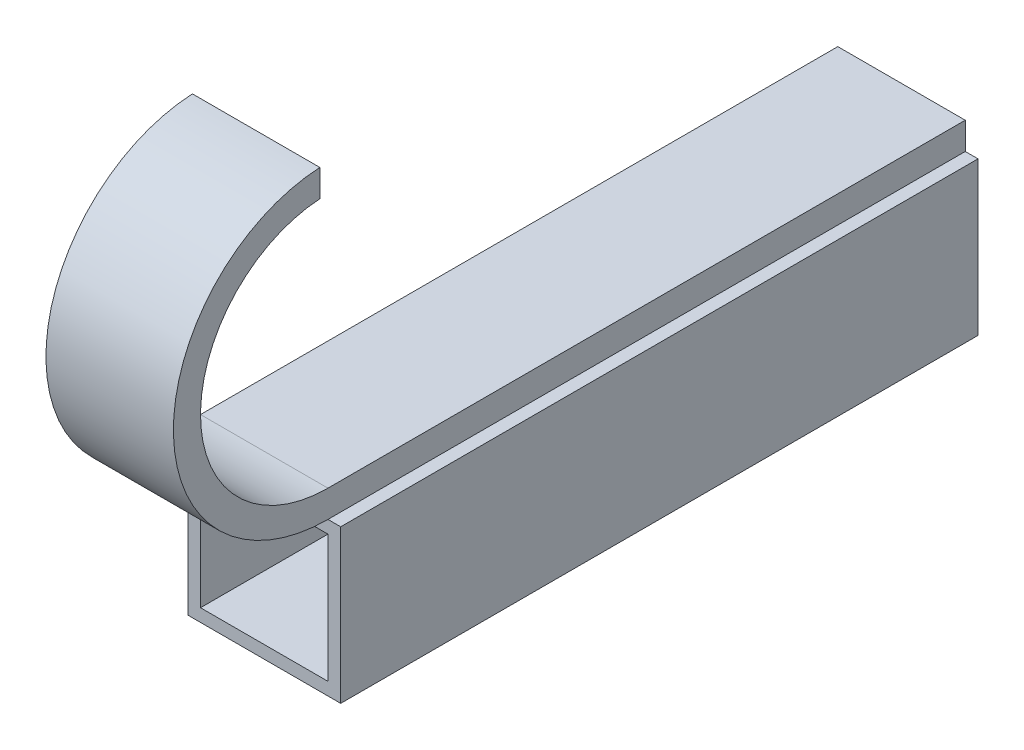
ISO-10303-21;
HEADER;
FILE_DESCRIPTION(('STEP AP214'),'2;1');
FILE_NAME('part.step','',(''),(''),'','','');
FILE_SCHEMA(('AUTOMOTIVE_DESIGN { 1 0 10303 214 1 1 1 1 }'));
ENDSEC;
DATA;
#1=APPLICATION_CONTEXT('core data for automotive mechanical design processes');
#2=APPLICATION_PROTOCOL_DEFINITION('international standard','automotive_design',2000,#1);
#3=PRODUCT_CONTEXT('',#1,'mechanical');
#4=PRODUCT('Part','Part','',(#3));
#5=PRODUCT_RELATED_PRODUCT_CATEGORY('part','',(#4));
#6=PRODUCT_DEFINITION_FORMATION('','',#4);
#7=PRODUCT_DEFINITION_CONTEXT('part definition',#1,'design');
#8=PRODUCT_DEFINITION('design','',#6,#7);
#9=PRODUCT_DEFINITION_SHAPE('','',#8);
#10=(LENGTH_UNIT() NAMED_UNIT(*) SI_UNIT(.MILLI.,.METRE.));
#11=(NAMED_UNIT(*) PLANE_ANGLE_UNIT() SI_UNIT($,.RADIAN.));
#12=(NAMED_UNIT(*) SI_UNIT($,.STERADIAN.) SOLID_ANGLE_UNIT());
#13=UNCERTAINTY_MEASURE_WITH_UNIT(LENGTH_MEASURE(1.E-05),#10,'distance_accuracy_value','');
#14=(GEOMETRIC_REPRESENTATION_CONTEXT(3) GLOBAL_UNCERTAINTY_ASSIGNED_CONTEXT((#13)) GLOBAL_UNIT_ASSIGNED_CONTEXT((#10,
#11,#12)) REPRESENTATION_CONTEXT('',''));
#15=CARTESIAN_POINT('',(0.,0.,0.));
#16=DIRECTION('',(0.,0.,1.));
#17=DIRECTION('',(1.,0.,0.));
#18=AXIS2_PLACEMENT_3D('',#15,#16,#17);
#19=CARTESIAN_POINT('',(-2.54,27.94,127.));
#20=DIRECTION('',(0.,-1.,0.));
#21=DIRECTION('',(0.,0.,-1.));
#22=AXIS2_PLACEMENT_3D('',#19,#20,#21);
#23=PLANE('',#22);
#24=DIRECTION('',(0.,0.,-1.));
#25=VECTOR('',#24,1.);
#26=CARTESIAN_POINT('',(25.4,27.94,127.));
#27=LINE('',#26,#25);
#28=CARTESIAN_POINT('',(25.4,27.94,127.));
#29=VERTEX_POINT('',#28);
#30=CARTESIAN_POINT('',(25.4,27.94,0.));
#31=VERTEX_POINT('',#30);
#32=EDGE_CURVE('E147',#29,#31,#27,.T.);
#33=ORIENTED_EDGE('',*,*,#32,.F.);
#34=DIRECTION('',(-1.,0.,0.));
#35=VECTOR('',#34,1.);
#36=CARTESIAN_POINT('',(-2.54,27.94,127.));
#37=LINE('',#36,#35);
#38=CARTESIAN_POINT('',(27.94,27.94,127.));
#39=VERTEX_POINT('',#38);
#40=EDGE_CURVE('E195',#39,#29,#37,.T.);
#41=ORIENTED_EDGE('',*,*,#40,.F.);
#42=DIRECTION('',(0.,0.,-1.));
#43=VECTOR('',#42,1.);
#44=CARTESIAN_POINT('',(27.94,27.94,127.));
#45=LINE('',#44,#43);
#46=CARTESIAN_POINT('',(27.94,27.94,0.));
#47=VERTEX_POINT('',#46);
#48=EDGE_CURVE('E41',#39,#47,#45,.T.);
#49=ORIENTED_EDGE('',*,*,#48,.T.);
#50=DIRECTION('',(-1.,0.,0.));
#51=VECTOR('',#50,1.);
#52=CARTESIAN_POINT('',(-2.54,27.94,0.));
#53=LINE('',#52,#51);
#54=EDGE_CURVE('E141',#47,#31,#53,.T.);
#55=ORIENTED_EDGE('',*,*,#54,.T.);
#56=EDGE_LOOP('',(#33,#41,#49,#55));
#57=FACE_BOUND('',#56,.T.);
#58=ADVANCED_FACE('F33',(#57),#23,.F.);
#59=CARTESIAN_POINT('',(0.,0.,127.));
#60=DIRECTION('',(0.,0.,1.));
#61=DIRECTION('',(1.,0.,0.));
#62=AXIS2_PLACEMENT_3D('',#59,#60,#61);
#63=PLANE('',#62);
#64=DIRECTION('',(1.,0.,0.));
#65=VECTOR('',#64,1.);
#66=CARTESIAN_POINT('',(-2.54,-2.54,127.));
#67=LINE('',#66,#65);
#68=CARTESIAN_POINT('',(-2.54,-2.54,127.));
#69=VERTEX_POINT('',#68);
#70=CARTESIAN_POINT('',(27.94,-2.54,127.));
#71=VERTEX_POINT('',#70);
#72=EDGE_CURVE('E164',#69,#71,#67,.T.);
#73=ORIENTED_EDGE('',*,*,#72,.T.);
#74=DIRECTION('',(0.,1.,0.));
#75=VECTOR('',#74,1.);
#76=CARTESIAN_POINT('',(27.94,-2.54,127.));
#77=LINE('',#76,#75);
#78=EDGE_CURVE('E198',#71,#39,#77,.T.);
#79=ORIENTED_EDGE('',*,*,#78,.T.);
#80=ORIENTED_EDGE('',*,*,#40,.T.);
#81=DIRECTION('',(-1.,0.,0.));
#82=VECTOR('',#81,1.);
#83=CARTESIAN_POINT('',(25.4,27.94,127.));
#84=LINE('',#83,#82);
#85=CARTESIAN_POINT('',(0.,27.94,127.));
#86=VERTEX_POINT('',#85);
#87=EDGE_CURVE('E237',#29,#86,#84,.T.);
#88=ORIENTED_EDGE('',*,*,#87,.T.);
#89=CARTESIAN_POINT('',(-2.54,27.94,127.));
#90=VERTEX_POINT('',#89);
#91=EDGE_CURVE('E197',#86,#90,#37,.T.);
#92=ORIENTED_EDGE('',*,*,#91,.T.);
#93=DIRECTION('',(0.,-1.,0.));
#94=VECTOR('',#93,1.);
#95=CARTESIAN_POINT('',(-2.54,-2.54,127.));
#96=LINE('',#95,#94);
#97=EDGE_CURVE('E174',#90,#69,#96,.T.);
#98=ORIENTED_EDGE('',*,*,#97,.T.);
#99=EDGE_LOOP('',(#73,#79,#80,#88,#92,#98));
#100=FACE_BOUND('',#99,.T.);
#101=DIRECTION('',(1.,0.,0.));
#102=VECTOR('',#101,1.);
#103=CARTESIAN_POINT('',(0.,0.,127.));
#104=LINE('',#103,#102);
#105=CARTESIAN_POINT('',(0.,0.,127.));
#106=VERTEX_POINT('',#105);
#107=CARTESIAN_POINT('',(25.4,0.,127.));
#108=VERTEX_POINT('',#107);
#109=EDGE_CURVE('E224',#106,#108,#104,.T.);
#110=ORIENTED_EDGE('',*,*,#109,.F.);
#111=DIRECTION('',(0.,-1.,0.));
#112=VECTOR('',#111,1.);
#113=CARTESIAN_POINT('',(0.,0.,127.));
#114=LINE('',#113,#112);
#115=CARTESIAN_POINT('',(0.,25.4,127.));
#116=VERTEX_POINT('',#115);
#117=EDGE_CURVE('E211',#116,#106,#114,.T.);
#118=ORIENTED_EDGE('',*,*,#117,.F.);
#119=DIRECTION('',(-1.,0.,0.));
#120=VECTOR('',#119,1.);
#121=CARTESIAN_POINT('',(0.,25.4,127.));
#122=LINE('',#121,#120);
#123=CARTESIAN_POINT('',(25.4,25.4,127.));
#124=VERTEX_POINT('',#123);
#125=EDGE_CURVE('E207',#124,#116,#122,.T.);
#126=ORIENTED_EDGE('',*,*,#125,.F.);
#127=DIRECTION('',(0.,1.,0.));
#128=VECTOR('',#127,1.);
#129=CARTESIAN_POINT('',(25.4,0.,127.));
#130=LINE('',#129,#128);
#131=EDGE_CURVE('E222',#108,#124,#130,.T.);
#132=ORIENTED_EDGE('',*,*,#131,.F.);
#133=EDGE_LOOP('',(#110,#118,#126,#132));
#134=FACE_BOUND('',#133,.T.);
#135=ADVANCED_FACE('F272',(#100,#134),#63,.T.);
#136=CARTESIAN_POINT('',(0.,0.,0.));
#137=DIRECTION('',(0.,0.,1.));
#138=DIRECTION('',(1.,0.,0.));
#139=AXIS2_PLACEMENT_3D('',#136,#137,#138);
#140=PLANE('',#139);
#141=DIRECTION('',(1.,0.,0.));
#142=VECTOR('',#141,1.);
#143=CARTESIAN_POINT('',(-2.54,-2.54,0.));
#144=LINE('',#143,#142);
#145=CARTESIAN_POINT('',(-2.54,-2.54,0.));
#146=VERTEX_POINT('',#145);
#147=CARTESIAN_POINT('',(27.94,-2.54,0.));
#148=VERTEX_POINT('',#147);
#149=EDGE_CURVE('E186',#146,#148,#144,.T.);
#150=ORIENTED_EDGE('',*,*,#149,.F.);
#151=DIRECTION('',(0.,-1.,0.));
#152=VECTOR('',#151,1.);
#153=CARTESIAN_POINT('',(-2.54,-2.54,0.));
#154=LINE('',#153,#152);
#155=CARTESIAN_POINT('',(-2.54,27.94,0.));
#156=VERTEX_POINT('',#155);
#157=EDGE_CURVE('E161',#156,#146,#154,.T.);
#158=ORIENTED_EDGE('',*,*,#157,.F.);
#159=CARTESIAN_POINT('',(0.,27.94,0.));
#160=VERTEX_POINT('',#159);
#161=EDGE_CURVE('E162',#160,#156,#53,.T.);
#162=ORIENTED_EDGE('',*,*,#161,.F.);
#163=DIRECTION('',(0.,1.,0.));
#164=VECTOR('',#163,1.);
#165=CARTESIAN_POINT('',(0.,27.94,0.));
#166=LINE('',#165,#164);
#167=CARTESIAN_POINT('',(0.,33.338518846251,0.));
#168=VERTEX_POINT('',#167);
#169=EDGE_CURVE('E48',#160,#168,#166,.T.);
#170=ORIENTED_EDGE('',*,*,#169,.T.);
#171=DIRECTION('',(-1.,0.,0.));
#172=VECTOR('',#171,1.);
#173=CARTESIAN_POINT('',(25.4,33.338518846251,0.));
#174=LINE('',#173,#172);
#175=CARTESIAN_POINT('',(25.4,33.338518846251,0.));
#176=VERTEX_POINT('',#175);
#177=EDGE_CURVE('E143',#176,#168,#174,.T.);
#178=ORIENTED_EDGE('',*,*,#177,.F.);
#179=DIRECTION('',(0.,1.,0.));
#180=VECTOR('',#179,1.);
#181=CARTESIAN_POINT('',(25.4,27.94,0.));
#182=LINE('',#181,#180);
#183=EDGE_CURVE('E135',#31,#176,#182,.T.);
#184=ORIENTED_EDGE('',*,*,#183,.F.);
#185=ORIENTED_EDGE('',*,*,#54,.F.);
#186=DIRECTION('',(0.,1.,0.));
#187=VECTOR('',#186,1.);
#188=CARTESIAN_POINT('',(27.94,-2.54,0.));
#189=LINE('',#188,#187);
#190=EDGE_CURVE('E166',#148,#47,#189,.T.);
#191=ORIENTED_EDGE('',*,*,#190,.F.);
#192=EDGE_LOOP('',(#150,#158,#162,#170,#178,#184,#185,#191));
#193=FACE_BOUND('',#192,.T.);
#194=DIRECTION('',(0.,-1.,0.));
#195=VECTOR('',#194,1.);
#196=CARTESIAN_POINT('',(0.,0.,0.));
#197=LINE('',#196,#195);
#198=CARTESIAN_POINT('',(0.,25.4,0.));
#199=VERTEX_POINT('',#198);
#200=CARTESIAN_POINT('',(0.,0.,0.));
#201=VERTEX_POINT('',#200);
#202=EDGE_CURVE('E218',#199,#201,#197,.T.);
#203=ORIENTED_EDGE('',*,*,#202,.T.);
#204=DIRECTION('',(1.,0.,0.));
#205=VECTOR('',#204,1.);
#206=CARTESIAN_POINT('',(0.,0.,0.));
#207=LINE('',#206,#205);
#208=CARTESIAN_POINT('',(25.4,0.,0.));
#209=VERTEX_POINT('',#208);
#210=EDGE_CURVE('E215',#201,#209,#207,.T.);
#211=ORIENTED_EDGE('',*,*,#210,.T.);
#212=DIRECTION('',(0.,1.,0.));
#213=VECTOR('',#212,1.);
#214=CARTESIAN_POINT('',(25.4,0.,0.));
#215=LINE('',#214,#213);
#216=CARTESIAN_POINT('',(25.4,25.4,0.));
#217=VERTEX_POINT('',#216);
#218=EDGE_CURVE('E212',#209,#217,#215,.T.);
#219=ORIENTED_EDGE('',*,*,#218,.T.);
#220=DIRECTION('',(-1.,0.,0.));
#221=VECTOR('',#220,1.);
#222=CARTESIAN_POINT('',(0.,25.4,0.));
#223=LINE('',#222,#221);
#224=EDGE_CURVE('E208',#217,#199,#223,.T.);
#225=ORIENTED_EDGE('',*,*,#224,.T.);
#226=EDGE_LOOP('',(#203,#211,#219,#225));
#227=FACE_BOUND('',#226,.T.);
#228=ADVANCED_FACE('F138',(#193,#227),#140,.F.);
#229=CARTESIAN_POINT('',(-2.54,-2.54,127.));
#230=DIRECTION('',(0.,1.,0.));
#231=DIRECTION('',(0.,0.,1.));
#232=AXIS2_PLACEMENT_3D('',#229,#230,#231);
#233=PLANE('',#232);
#234=ORIENTED_EDGE('',*,*,#149,.T.);
#235=DIRECTION('',(0.,0.,-1.));
#236=VECTOR('',#235,1.);
#237=CARTESIAN_POINT('',(27.94,-2.54,127.));
#238=LINE('',#237,#236);
#239=EDGE_CURVE('E11',#71,#148,#238,.T.);
#240=ORIENTED_EDGE('',*,*,#239,.F.);
#241=ORIENTED_EDGE('',*,*,#72,.F.);
#242=DIRECTION('',(0.,0.,-1.));
#243=VECTOR('',#242,1.);
#244=CARTESIAN_POINT('',(-2.54,-2.54,127.));
#245=LINE('',#244,#243);
#246=EDGE_CURVE('E170',#69,#146,#245,.T.);
#247=ORIENTED_EDGE('',*,*,#246,.T.);
#248=EDGE_LOOP('',(#234,#240,#241,#247));
#249=FACE_BOUND('',#248,.T.);
#250=ADVANCED_FACE('F35',(#249),#233,.F.);
#251=CARTESIAN_POINT('',(27.94,-2.54,127.));
#252=DIRECTION('',(-1.,0.,0.));
#253=DIRECTION('',(0.,0.,1.));
#254=AXIS2_PLACEMENT_3D('',#251,#252,#253);
#255=PLANE('',#254);
#256=ORIENTED_EDGE('',*,*,#190,.T.);
#257=ORIENTED_EDGE('',*,*,#48,.F.);
#258=ORIENTED_EDGE('',*,*,#78,.F.);
#259=ORIENTED_EDGE('',*,*,#239,.T.);
#260=EDGE_LOOP('',(#256,#257,#258,#259));
#261=FACE_BOUND('',#260,.T.);
#262=ADVANCED_FACE('F276',(#261),#255,.F.);
#263=ORIENTED_EDGE('',*,*,#91,.F.);
#264=DIRECTION('',(0.,0.,-1.));
#265=VECTOR('',#264,1.);
#266=CARTESIAN_POINT('',(0.,27.94,127.));
#267=LINE('',#266,#265);
#268=EDGE_CURVE('E248',#86,#160,#267,.T.);
#269=ORIENTED_EDGE('',*,*,#268,.T.);
#270=ORIENTED_EDGE('',*,*,#161,.T.);
#271=DIRECTION('',(0.,0.,-1.));
#272=VECTOR('',#271,1.);
#273=CARTESIAN_POINT('',(-2.54,27.94,127.));
#274=LINE('',#273,#272);
#275=EDGE_CURVE('E173',#90,#156,#274,.T.);
#276=ORIENTED_EDGE('',*,*,#275,.F.);
#277=EDGE_LOOP('',(#263,#269,#270,#276));
#278=FACE_BOUND('',#277,.T.);
#279=ADVANCED_FACE('F282',(#278),#23,.F.);
#280=CARTESIAN_POINT('',(-2.54,-2.54,127.));
#281=DIRECTION('',(1.,0.,0.));
#282=DIRECTION('',(0.,0.,-1.));
#283=AXIS2_PLACEMENT_3D('',#280,#281,#282);
#284=PLANE('',#283);
#285=ORIENTED_EDGE('',*,*,#157,.T.);
#286=ORIENTED_EDGE('',*,*,#246,.F.);
#287=ORIENTED_EDGE('',*,*,#97,.F.);
#288=ORIENTED_EDGE('',*,*,#275,.T.);
#289=EDGE_LOOP('',(#285,#286,#287,#288));
#290=FACE_BOUND('',#289,.T.);
#291=ADVANCED_FACE('F180',(#290),#284,.F.);
#292=CARTESIAN_POINT('',(0.,0.,127.));
#293=DIRECTION('',(1.,0.,0.));
#294=DIRECTION('',(0.,1.,0.));
#295=AXIS2_PLACEMENT_3D('',#292,#293,#294);
#296=PLANE('',#295);
#297=ORIENTED_EDGE('',*,*,#202,.F.);
#298=DIRECTION('',(0.,0.,-1.));
#299=VECTOR('',#298,1.);
#300=CARTESIAN_POINT('',(0.,25.4,127.));
#301=LINE('',#300,#299);
#302=EDGE_CURVE('E204',#116,#199,#301,.T.);
#303=ORIENTED_EDGE('',*,*,#302,.F.);
#304=ORIENTED_EDGE('',*,*,#117,.T.);
#305=DIRECTION('',(0.,0.,-1.));
#306=VECTOR('',#305,1.);
#307=CARTESIAN_POINT('',(0.,0.,127.));
#308=LINE('',#307,#306);
#309=EDGE_CURVE('E189',#106,#201,#308,.T.);
#310=ORIENTED_EDGE('',*,*,#309,.T.);
#311=EDGE_LOOP('',(#297,#303,#304,#310));
#312=FACE_BOUND('',#311,.T.);
#313=ADVANCED_FACE('F295',(#312),#296,.T.);
#314=CARTESIAN_POINT('',(0.,0.,127.));
#315=DIRECTION('',(0.,1.,0.));
#316=DIRECTION('',(0.,0.,1.));
#317=AXIS2_PLACEMENT_3D('',#314,#315,#316);
#318=PLANE('',#317);
#319=ORIENTED_EDGE('',*,*,#210,.F.);
#320=ORIENTED_EDGE('',*,*,#309,.F.);
#321=ORIENTED_EDGE('',*,*,#109,.T.);
#322=DIRECTION('',(0.,0.,-1.));
#323=VECTOR('',#322,1.);
#324=CARTESIAN_POINT('',(25.4,0.,127.));
#325=LINE('',#324,#323);
#326=EDGE_CURVE('E191',#108,#209,#325,.T.);
#327=ORIENTED_EDGE('',*,*,#326,.T.);
#328=EDGE_LOOP('',(#319,#320,#321,#327));
#329=FACE_BOUND('',#328,.T.);
#330=ADVANCED_FACE('F318',(#329),#318,.T.);
#331=CARTESIAN_POINT('',(25.4,0.,127.));
#332=DIRECTION('',(-1.,0.,0.));
#333=DIRECTION('',(0.,-1.,0.));
#334=AXIS2_PLACEMENT_3D('',#331,#332,#333);
#335=PLANE('',#334);
#336=ORIENTED_EDGE('',*,*,#218,.F.);
#337=ORIENTED_EDGE('',*,*,#326,.F.);
#338=ORIENTED_EDGE('',*,*,#131,.T.);
#339=DIRECTION('',(0.,0.,-1.));
#340=VECTOR('',#339,1.);
#341=CARTESIAN_POINT('',(25.4,25.4,127.));
#342=LINE('',#341,#340);
#343=EDGE_CURVE('E56',#124,#217,#342,.T.);
#344=ORIENTED_EDGE('',*,*,#343,.T.);
#345=EDGE_LOOP('',(#336,#337,#338,#344));
#346=FACE_BOUND('',#345,.T.);
#347=ADVANCED_FACE('F315',(#346),#335,.T.);
#348=CARTESIAN_POINT('',(0.,25.4,127.));
#349=DIRECTION('',(0.,-1.,0.));
#350=DIRECTION('',(0.,0.,-1.));
#351=AXIS2_PLACEMENT_3D('',#348,#349,#350);
#352=PLANE('',#351);
#353=ORIENTED_EDGE('',*,*,#224,.F.);
#354=ORIENTED_EDGE('',*,*,#343,.F.);
#355=ORIENTED_EDGE('',*,*,#125,.T.);
#356=ORIENTED_EDGE('',*,*,#302,.T.);
#357=EDGE_LOOP('',(#353,#354,#355,#356));
#358=FACE_BOUND('',#357,.T.);
#359=ADVANCED_FACE('F312',(#358),#352,.T.);
#360=CARTESIAN_POINT('',(25.4,33.338518846251,0.));
#361=DIRECTION('',(0.,-1.,0.));
#362=DIRECTION('',(0.,0.,-1.));
#363=AXIS2_PLACEMENT_3D('',#360,#361,#362);
#364=PLANE('',#363);
#365=DIRECTION('',(0.,0.,1.));
#366=VECTOR('',#365,1.);
#367=CARTESIAN_POINT('',(0.,33.338518846251,0.));
#368=LINE('',#367,#366);
#369=CARTESIAN_POINT('',(0.,33.338518846251,127.));
#370=VERTEX_POINT('',#369);
#371=EDGE_CURVE('E245',#168,#370,#368,.T.);
#372=ORIENTED_EDGE('',*,*,#371,.T.);
#373=DIRECTION('',(-1.,0.,0.));
#374=VECTOR('',#373,1.);
#375=CARTESIAN_POINT('',(25.4,33.338518846251,127.));
#376=LINE('',#375,#374);
#377=CARTESIAN_POINT('',(25.4,33.338518846251,127.));
#378=VERTEX_POINT('',#377);
#379=EDGE_CURVE('E228',#378,#370,#376,.T.);
#380=ORIENTED_EDGE('',*,*,#379,.F.);
#381=DIRECTION('',(0.,0.,1.));
#382=VECTOR('',#381,1.);
#383=CARTESIAN_POINT('',(25.4,33.338518846251,0.));
#384=LINE('',#383,#382);
#385=EDGE_CURVE('E146',#176,#378,#384,.T.);
#386=ORIENTED_EDGE('',*,*,#385,.F.);
#387=ORIENTED_EDGE('',*,*,#177,.T.);
#388=EDGE_LOOP('',(#372,#380,#386,#387));
#389=FACE_BOUND('',#388,.T.);
#390=ADVANCED_FACE('F259',(#389),#364,.F.);
#391=CARTESIAN_POINT('',(25.4,58.738518846251,127.));
#392=DIRECTION('',(-1.,0.,0.));
#393=DIRECTION('',(0.,0.,1.));
#394=AXIS2_PLACEMENT_3D('',#391,#392,#393);
#395=CYLINDRICAL_SURFACE('',#394,25.4);
#396=CARTESIAN_POINT('',(0.,58.738518846251,127.));
#397=DIRECTION('',(-1.,0.,0.));
#398=DIRECTION('',(0.,0.,1.));
#399=AXIS2_PLACEMENT_3D('',#396,#397,#398);
#400=CIRCLE('',#399,25.4);
#401=CARTESIAN_POINT('',(0.,84.0871411088364,128.614728890173));
#402=VERTEX_POINT('',#401);
#403=EDGE_CURVE('E243',#370,#402,#400,.T.);
#404=ORIENTED_EDGE('',*,*,#403,.T.);
#405=DIRECTION('',(-1.,0.,0.));
#406=VECTOR('',#405,1.);
#407=CARTESIAN_POINT('',(25.4,84.0871411088364,128.614728890173));
#408=LINE('',#407,#406);
#409=CARTESIAN_POINT('',(25.4,84.0871411088364,128.614728890173));
#410=VERTEX_POINT('',#409);
#411=EDGE_CURVE('E231',#410,#402,#408,.T.);
#412=ORIENTED_EDGE('',*,*,#411,.F.);
#413=CARTESIAN_POINT('',(25.4,58.738518846251,127.));
#414=DIRECTION('',(-1.,0.,0.));
#415=DIRECTION('',(0.,0.,1.));
#416=AXIS2_PLACEMENT_3D('',#413,#414,#415);
#417=CIRCLE('',#416,25.4);
#418=EDGE_CURVE('E253',#378,#410,#417,.T.);
#419=ORIENTED_EDGE('',*,*,#418,.F.);
#420=ORIENTED_EDGE('',*,*,#379,.T.);
#421=EDGE_LOOP('',(#404,#412,#419,#420));
#422=FACE_BOUND('',#421,.T.);
#423=ADVANCED_FACE('F262',(#422),#395,.F.);
#424=CARTESIAN_POINT('',(25.4,84.0871411088364,128.614728890173));
#425=DIRECTION('',(0.,0.,1.));
#426=DIRECTION('',(0.,-1.,0.));
#427=AXIS2_PLACEMENT_3D('',#424,#425,#426);
#428=PLANE('',#427);
#429=DIRECTION('',(0.,1.,0.));
#430=VECTOR('',#429,1.);
#431=CARTESIAN_POINT('',(0.,84.0871411088364,128.614728890173));
#432=LINE('',#431,#430);
#433=CARTESIAN_POINT('',(0.,89.4946794280616,128.614728890173));
#434=VERTEX_POINT('',#433);
#435=EDGE_CURVE('E241',#402,#434,#432,.T.);
#436=ORIENTED_EDGE('',*,*,#435,.T.);
#437=DIRECTION('',(-1.,0.,0.));
#438=VECTOR('',#437,1.);
#439=CARTESIAN_POINT('',(25.4,89.4946794280616,128.614728890173));
#440=LINE('',#439,#438);
#441=CARTESIAN_POINT('',(25.4,89.4946794280616,128.614728890173));
#442=VERTEX_POINT('',#441);
#443=EDGE_CURVE('E234',#442,#434,#440,.T.);
#444=ORIENTED_EDGE('',*,*,#443,.F.);
#445=DIRECTION('',(0.,1.,0.));
#446=VECTOR('',#445,1.);
#447=CARTESIAN_POINT('',(25.4,84.0871411088364,128.614728890173));
#448=LINE('',#447,#446);
#449=EDGE_CURVE('E251',#410,#442,#448,.T.);
#450=ORIENTED_EDGE('',*,*,#449,.F.);
#451=ORIENTED_EDGE('',*,*,#411,.T.);
#452=EDGE_LOOP('',(#436,#444,#450,#451));
#453=FACE_BOUND('',#452,.T.);
#454=ADVANCED_FACE('F267',(#453),#428,.F.);
#455=CARTESIAN_POINT('',(25.4,58.738518846251,127.));
#456=DIRECTION('',(-1.,0.,0.));
#457=DIRECTION('',(0.,0.,1.));
#458=AXIS2_PLACEMENT_3D('',#455,#456,#457);
#459=CYLINDRICAL_SURFACE('',#458,30.798518846251);
#460=CARTESIAN_POINT('',(0.,58.738518846251,127.));
#461=DIRECTION('',(1.,0.,0.));
#462=DIRECTION('',(0.,0.,-1.));
#463=AXIS2_PLACEMENT_3D('',#460,#461,#462);
#464=CIRCLE('',#463,30.798518846251);
#465=EDGE_CURVE('E157',#434,#86,#464,.T.);
#466=ORIENTED_EDGE('',*,*,#465,.T.);
#467=ORIENTED_EDGE('',*,*,#87,.F.);
#468=CARTESIAN_POINT('',(25.4,58.738518846251,127.));
#469=DIRECTION('',(1.,0.,0.));
#470=DIRECTION('',(0.,0.,-1.));
#471=AXIS2_PLACEMENT_3D('',#468,#469,#470);
#472=CIRCLE('',#471,30.798518846251);
#473=EDGE_CURVE('E152',#442,#29,#472,.T.);
#474=ORIENTED_EDGE('',*,*,#473,.F.);
#475=ORIENTED_EDGE('',*,*,#443,.T.);
#476=EDGE_LOOP('',(#466,#467,#474,#475));
#477=FACE_BOUND('',#476,.T.);
#478=ADVANCED_FACE('F270',(#477),#459,.T.);
#479=CARTESIAN_POINT('',(25.4,58.738518846251,127.));
#480=DIRECTION('',(-1.,0.,0.));
#481=DIRECTION('',(0.,0.,1.));
#482=AXIS2_PLACEMENT_3D('',#479,#480,#481);
#483=PLANE('',#482);
#484=ORIENTED_EDGE('',*,*,#32,.T.);
#485=ORIENTED_EDGE('',*,*,#183,.T.);
#486=ORIENTED_EDGE('',*,*,#385,.T.);
#487=ORIENTED_EDGE('',*,*,#418,.T.);
#488=ORIENTED_EDGE('',*,*,#449,.T.);
#489=ORIENTED_EDGE('',*,*,#473,.T.);
#490=EDGE_LOOP('',(#484,#485,#486,#487,#488,#489));
#491=FACE_BOUND('',#490,.T.);
#492=ADVANCED_FACE('F150',(#491),#483,.F.);
#493=CARTESIAN_POINT('',(0.,58.738518846251,127.));
#494=DIRECTION('',(-1.,0.,0.));
#495=DIRECTION('',(0.,0.,1.));
#496=AXIS2_PLACEMENT_3D('',#493,#494,#495);
#497=PLANE('',#496);
#498=ORIENTED_EDGE('',*,*,#268,.F.);
#499=ORIENTED_EDGE('',*,*,#465,.F.);
#500=ORIENTED_EDGE('',*,*,#435,.F.);
#501=ORIENTED_EDGE('',*,*,#403,.F.);
#502=ORIENTED_EDGE('',*,*,#371,.F.);
#503=ORIENTED_EDGE('',*,*,#169,.F.);
#504=EDGE_LOOP('',(#498,#499,#500,#501,#502,#503));
#505=FACE_BOUND('',#504,.T.);
#506=ADVANCED_FACE('F296',(#505),#497,.T.);
#507=CLOSED_SHELL('',(#58,#135,#228,#250,#262,#279,#291,#313,#330,#347,#359,#390,#423,#454,#478,
#492,#506));
#508=MANIFOLD_SOLID_BREP('B2',#507);
#509=ADVANCED_BREP_SHAPE_REPRESENTATION('',(#18,#508),#14);
#510=SHAPE_DEFINITION_REPRESENTATION(#9,#509);
ENDSEC;
END-ISO-10303-21;
